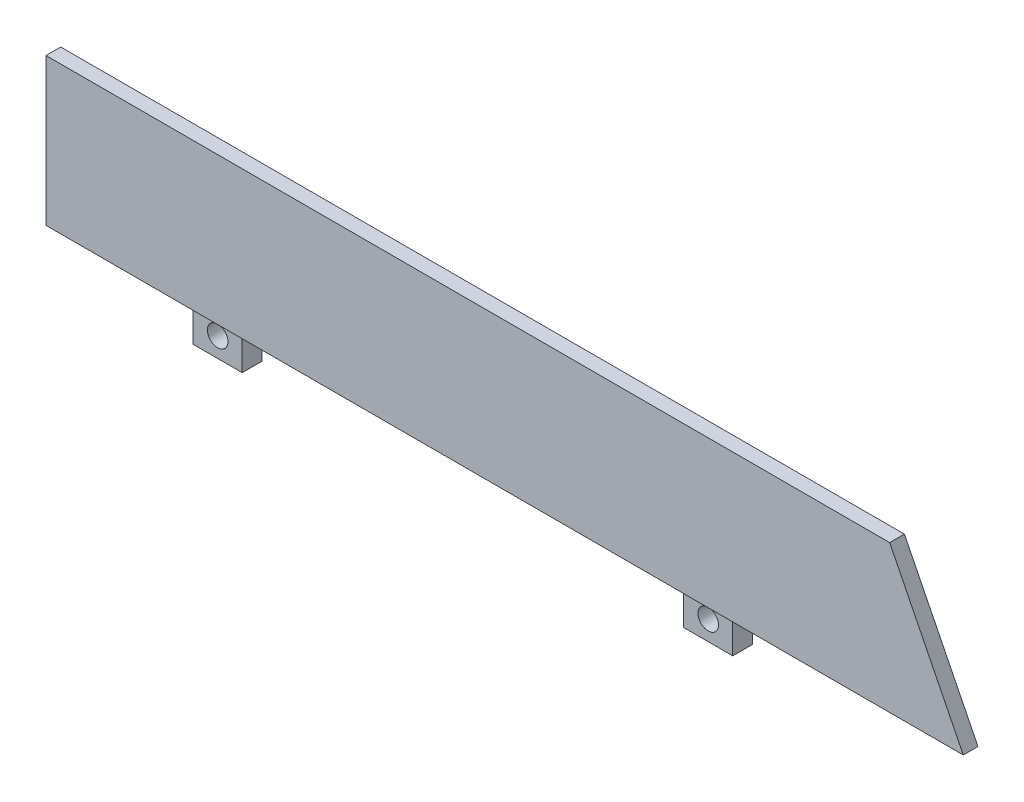
ISO-10303-21;
HEADER;
FILE_DESCRIPTION(('STEP AP214'),'2;1');
FILE_NAME('part.step','',(''),(''),'','','');
FILE_SCHEMA(('AUTOMOTIVE_DESIGN { 1 0 10303 214 1 1 1 1 }'));
ENDSEC;
DATA;
#1=APPLICATION_CONTEXT('core data for automotive mechanical design processes');
#2=APPLICATION_PROTOCOL_DEFINITION('international standard','automotive_design',2000,#1);
#3=PRODUCT_CONTEXT('',#1,'mechanical');
#4=PRODUCT('Part','Part','',(#3));
#5=PRODUCT_RELATED_PRODUCT_CATEGORY('part','',(#4));
#6=PRODUCT_DEFINITION_FORMATION('','',#4);
#7=PRODUCT_DEFINITION_CONTEXT('part definition',#1,'design');
#8=PRODUCT_DEFINITION('design','',#6,#7);
#9=PRODUCT_DEFINITION_SHAPE('','',#8);
#10=(LENGTH_UNIT() NAMED_UNIT(*) SI_UNIT(.MILLI.,.METRE.));
#11=(NAMED_UNIT(*) PLANE_ANGLE_UNIT() SI_UNIT($,.RADIAN.));
#12=(NAMED_UNIT(*) SI_UNIT($,.STERADIAN.) SOLID_ANGLE_UNIT());
#13=UNCERTAINTY_MEASURE_WITH_UNIT(LENGTH_MEASURE(1.E-05),#10,'distance_accuracy_value','');
#14=(GEOMETRIC_REPRESENTATION_CONTEXT(3) GLOBAL_UNCERTAINTY_ASSIGNED_CONTEXT((#13)) GLOBAL_UNIT_ASSIGNED_CONTEXT((#10,
#11,#12)) REPRESENTATION_CONTEXT('',''));
#15=CARTESIAN_POINT('',(0.,0.,0.));
#16=DIRECTION('',(0.,0.,1.));
#17=DIRECTION('',(1.,0.,0.));
#18=AXIS2_PLACEMENT_3D('',#15,#16,#17);
#19=CARTESIAN_POINT('',(0.,0.,0.));
#20=DIRECTION('',(0.,0.,-1.));
#21=DIRECTION('',(-1.,0.,0.));
#22=AXIS2_PLACEMENT_3D('',#19,#20,#21);
#23=PLANE('',#22);
#24=DIRECTION('',(1.,0.,0.));
#25=VECTOR('',#24,1.);
#26=CARTESIAN_POINT('',(0.,0.,0.));
#27=LINE('',#26,#25);
#28=CARTESIAN_POINT('',(41.0000000000001,0.,0.));
#29=VERTEX_POINT('',#28);
#30=CARTESIAN_POINT('',(123.,0.,0.));
#31=VERTEX_POINT('',#30);
#32=EDGE_CURVE('E387',#29,#31,#27,.T.);
#33=ORIENTED_EDGE('',*,*,#32,.F.);
#34=DIRECTION('',(0.,1.,0.));
#35=VECTOR('',#34,1.);
#36=CARTESIAN_POINT('',(41.0000000000001,0.,0.));
#37=LINE('',#36,#35);
#38=CARTESIAN_POINT('',(41.0000000000001,9.00000000000006,0.));
#39=VERTEX_POINT('',#38);
#40=EDGE_CURVE('E333',#29,#39,#37,.T.);
#41=ORIENTED_EDGE('',*,*,#40,.T.);
#42=DIRECTION('',(-1.,0.,0.));
#43=VECTOR('',#42,1.);
#44=CARTESIAN_POINT('',(0.,9.00000000000006,0.));
#45=LINE('',#44,#43);
#46=CARTESIAN_POINT('',(22.9999999999999,9.00000000000006,0.));
#47=VERTEX_POINT('',#46);
#48=EDGE_CURVE('E330',#39,#47,#45,.T.);
#49=ORIENTED_EDGE('',*,*,#48,.T.);
#50=DIRECTION('',(0.,-1.,0.));
#51=VECTOR('',#50,1.);
#52=CARTESIAN_POINT('',(22.9999999999999,0.,0.));
#53=LINE('',#52,#51);
#54=CARTESIAN_POINT('',(22.9999999999999,0.,0.));
#55=VERTEX_POINT('',#54);
#56=EDGE_CURVE('E327',#47,#55,#53,.T.);
#57=ORIENTED_EDGE('',*,*,#56,.T.);
#58=CARTESIAN_POINT('',(0.,0.,0.));
#59=VERTEX_POINT('',#58);
#60=EDGE_CURVE('E290',#59,#55,#27,.T.);
#61=ORIENTED_EDGE('',*,*,#60,.F.);
#62=DIRECTION('',(0.,-1.,0.));
#63=VECTOR('',#62,1.);
#64=CARTESIAN_POINT('',(0.,0.,0.));
#65=LINE('',#64,#63);
#66=CARTESIAN_POINT('',(0.,30.,0.));
#67=VERTEX_POINT('',#66);
#68=EDGE_CURVE('E270',#67,#59,#65,.T.);
#69=ORIENTED_EDGE('',*,*,#68,.F.);
#70=DIRECTION('',(-1.,0.,0.));
#71=VECTOR('',#70,1.);
#72=CARTESIAN_POINT('',(0.,30.,0.));
#73=LINE('',#72,#71);
#74=CARTESIAN_POINT('',(171.996760863076,30.,0.));
#75=VERTEX_POINT('',#74);
#76=EDGE_CURVE('E276',#75,#67,#73,.T.);
#77=ORIENTED_EDGE('',*,*,#76,.F.);
#78=DIRECTION('',(-0.447290848418708,0.894388560370084,0.));
#79=VECTOR('',#78,1.);
#80=CARTESIAN_POINT('',(171.996760863076,30.,0.));
#81=LINE('',#80,#79);
#82=CARTESIAN_POINT('',(187.,0.,0.));
#83=VERTEX_POINT('',#82);
#84=EDGE_CURVE('E294',#83,#75,#81,.T.);
#85=ORIENTED_EDGE('',*,*,#84,.F.);
#86=CARTESIAN_POINT('',(141.,0.,0.));
#87=VERTEX_POINT('',#86);
#88=EDGE_CURVE('E289',#87,#83,#27,.T.);
#89=ORIENTED_EDGE('',*,*,#88,.F.);
#90=DIRECTION('',(0.,1.,0.));
#91=VECTOR('',#90,1.);
#92=CARTESIAN_POINT('',(141.,0.,0.));
#93=LINE('',#92,#91);
#94=CARTESIAN_POINT('',(141.,9.00000000000001,0.));
#95=VERTEX_POINT('',#94);
#96=EDGE_CURVE('E318',#87,#95,#93,.T.);
#97=ORIENTED_EDGE('',*,*,#96,.T.);
#98=DIRECTION('',(-1.,0.,0.));
#99=VECTOR('',#98,1.);
#100=CARTESIAN_POINT('',(0.,8.99999999999999,0.));
#101=LINE('',#100,#99);
#102=CARTESIAN_POINT('',(123.,9.00000000000001,0.));
#103=VERTEX_POINT('',#102);
#104=EDGE_CURVE('E321',#95,#103,#101,.T.);
#105=ORIENTED_EDGE('',*,*,#104,.T.);
#106=DIRECTION('',(0.,-1.,0.));
#107=VECTOR('',#106,1.);
#108=CARTESIAN_POINT('',(123.,0.,0.));
#109=LINE('',#108,#107);
#110=EDGE_CURVE('E324',#103,#31,#109,.T.);
#111=ORIENTED_EDGE('',*,*,#110,.T.);
#112=EDGE_LOOP('',(#33,#41,#49,#57,#61,#69,#77,#85,#89,#97,#105,#111));
#113=FACE_BOUND('',#112,.T.);
#114=ADVANCED_FACE('F47',(#113),#23,.T.);
#115=CARTESIAN_POINT('',(0.,0.,3.));
#116=DIRECTION('',(1.,0.,0.));
#117=DIRECTION('',(0.,0.,-1.));
#118=AXIS2_PLACEMENT_3D('',#115,#116,#117);
#119=PLANE('',#118);
#120=ORIENTED_EDGE('',*,*,#68,.T.);
#121=DIRECTION('',(0.,0.,-1.));
#122=VECTOR('',#121,1.);
#123=CARTESIAN_POINT('',(0.,0.,3.));
#124=LINE('',#123,#122);
#125=CARTESIAN_POINT('',(0.,0.,3.));
#126=VERTEX_POINT('',#125);
#127=EDGE_CURVE('E311',#126,#59,#124,.T.);
#128=ORIENTED_EDGE('',*,*,#127,.F.);
#129=DIRECTION('',(0.,-1.,0.));
#130=VECTOR('',#129,1.);
#131=CARTESIAN_POINT('',(0.,0.,3.));
#132=LINE('',#131,#130);
#133=CARTESIAN_POINT('',(0.,30.,3.));
#134=VERTEX_POINT('',#133);
#135=EDGE_CURVE('E271',#134,#126,#132,.T.);
#136=ORIENTED_EDGE('',*,*,#135,.F.);
#137=DIRECTION('',(0.,0.,-1.));
#138=VECTOR('',#137,1.);
#139=CARTESIAN_POINT('',(0.,30.,3.));
#140=LINE('',#139,#138);
#141=EDGE_CURVE('E285',#134,#67,#140,.T.);
#142=ORIENTED_EDGE('',*,*,#141,.T.);
#143=EDGE_LOOP('',(#120,#128,#136,#142));
#144=FACE_BOUND('',#143,.T.);
#145=ADVANCED_FACE('F422',(#144),#119,.F.);
#146=CARTESIAN_POINT('',(0.,0.,3.));
#147=DIRECTION('',(0.,1.,0.));
#148=DIRECTION('',(0.,0.,1.));
#149=AXIS2_PLACEMENT_3D('',#146,#147,#148);
#150=PLANE('',#149);
#151=ORIENTED_EDGE('',*,*,#60,.T.);
#152=DIRECTION('',(0.707106781186552,0.,-0.707106781186543));
#153=VECTOR('',#152,1.);
#154=CARTESIAN_POINT('',(9.99999999999981,0.,12.9999999999999));
#155=LINE('',#154,#153);
#156=CARTESIAN_POINT('',(27.,0.,-4.));
#157=VERTEX_POINT('',#156);
#158=EDGE_CURVE('E346',#55,#157,#155,.T.);
#159=ORIENTED_EDGE('',*,*,#158,.T.);
#160=DIRECTION('',(0.,0.,-1.));
#161=VECTOR('',#160,1.);
#162=CARTESIAN_POINT('',(27.,0.,3.));
#163=LINE('',#162,#161);
#164=CARTESIAN_POINT('',(27.,0.,0.));
#165=VERTEX_POINT('',#164);
#166=EDGE_CURVE('E73',#165,#157,#163,.T.);
#167=ORIENTED_EDGE('',*,*,#166,.F.);
#168=CARTESIAN_POINT('',(37.,0.,0.));
#169=VERTEX_POINT('',#168);
#170=EDGE_CURVE('E201',#165,#169,#27,.T.);
#171=ORIENTED_EDGE('',*,*,#170,.T.);
#172=DIRECTION('',(0.,0.,1.));
#173=VECTOR('',#172,1.);
#174=CARTESIAN_POINT('',(37.,0.,3.));
#175=LINE('',#174,#173);
#176=CARTESIAN_POINT('',(37.,0.,-4.));
#177=VERTEX_POINT('',#176);
#178=EDGE_CURVE('E315',#177,#169,#175,.T.);
#179=ORIENTED_EDGE('',*,*,#178,.F.);
#180=DIRECTION('',(0.707106781186552,0.,0.707106781186543));
#181=VECTOR('',#180,1.);
#182=CARTESIAN_POINT('',(21.9999999999997,0.,-19.0000000000001));
#183=LINE('',#182,#181);
#184=EDGE_CURVE('E343',#177,#29,#183,.T.);
#185=ORIENTED_EDGE('',*,*,#184,.T.);
#186=ORIENTED_EDGE('',*,*,#32,.T.);
#187=DIRECTION('',(0.707106781186543,0.,-0.707106781186552));
#188=VECTOR('',#187,1.);
#189=CARTESIAN_POINT('',(60.0000000000009,0.,63.));
#190=LINE('',#189,#188);
#191=CARTESIAN_POINT('',(127.,0.,-4.));
#192=VERTEX_POINT('',#191);
#193=EDGE_CURVE('E58',#31,#192,#190,.T.);
#194=ORIENTED_EDGE('',*,*,#193,.T.);
#195=DIRECTION('',(0.,0.,-1.));
#196=VECTOR('',#195,1.);
#197=CARTESIAN_POINT('',(127.,0.,3.));
#198=LINE('',#197,#196);
#199=CARTESIAN_POINT('',(127.,0.,0.));
#200=VERTEX_POINT('',#199);
#201=EDGE_CURVE('E66',#200,#192,#198,.T.);
#202=ORIENTED_EDGE('',*,*,#201,.F.);
#203=CARTESIAN_POINT('',(137.,0.,0.));
#204=VERTEX_POINT('',#203);
#205=EDGE_CURVE('E295',#200,#204,#27,.T.);
#206=ORIENTED_EDGE('',*,*,#205,.T.);
#207=DIRECTION('',(0.,0.,1.));
#208=VECTOR('',#207,1.);
#209=CARTESIAN_POINT('',(137.,0.,3.));
#210=LINE('',#209,#208);
#211=CARTESIAN_POINT('',(137.,0.,-4.));
#212=VERTEX_POINT('',#211);
#213=EDGE_CURVE('E340',#212,#204,#210,.T.);
#214=ORIENTED_EDGE('',*,*,#213,.F.);
#215=DIRECTION('',(0.707106781186543,0.,0.707106781186552));
#216=VECTOR('',#215,1.);
#217=CARTESIAN_POINT('',(72.000000000001,0.,-69.));
#218=LINE('',#217,#216);
#219=EDGE_CURVE('E11',#212,#87,#218,.T.);
#220=ORIENTED_EDGE('',*,*,#219,.T.);
#221=ORIENTED_EDGE('',*,*,#88,.T.);
#222=DIRECTION('',(0.,0.,-1.));
#223=VECTOR('',#222,1.);
#224=CARTESIAN_POINT('',(187.,0.,3.));
#225=LINE('',#224,#223);
#226=CARTESIAN_POINT('',(187.,0.,3.));
#227=VERTEX_POINT('',#226);
#228=EDGE_CURVE('E307',#227,#83,#225,.T.);
#229=ORIENTED_EDGE('',*,*,#228,.F.);
#230=DIRECTION('',(1.,0.,0.));
#231=VECTOR('',#230,1.);
#232=CARTESIAN_POINT('',(0.,0.,3.));
#233=LINE('',#232,#231);
#234=EDGE_CURVE('E275',#126,#227,#233,.T.);
#235=ORIENTED_EDGE('',*,*,#234,.F.);
#236=ORIENTED_EDGE('',*,*,#127,.T.);
#237=EDGE_LOOP('',(#151,#159,#167,#171,#179,#185,#186,#194,#202,#206,#214,#220,#221,#229,#235,#236));
#238=FACE_BOUND('',#237,.T.);
#239=ADVANCED_FACE('F392',(#238),#150,.F.);
#240=CARTESIAN_POINT('',(171.996760863076,30.,3.));
#241=DIRECTION('',(-0.894388560370085,-0.447290848418708,0.));
#242=DIRECTION('',(0.447290848418708,-0.894388560370085,0.));
#243=AXIS2_PLACEMENT_3D('',#240,#241,#242);
#244=PLANE('',#243);
#245=ORIENTED_EDGE('',*,*,#84,.T.);
#246=DIRECTION('',(0.,0.,-1.));
#247=VECTOR('',#246,1.);
#248=CARTESIAN_POINT('',(171.996760863076,30.,3.));
#249=LINE('',#248,#247);
#250=CARTESIAN_POINT('',(171.996760863076,30.,3.));
#251=VERTEX_POINT('',#250);
#252=EDGE_CURVE('E303',#251,#75,#249,.T.);
#253=ORIENTED_EDGE('',*,*,#252,.F.);
#254=DIRECTION('',(-0.447290848418708,0.894388560370084,0.));
#255=VECTOR('',#254,1.);
#256=CARTESIAN_POINT('',(171.996760863076,30.,3.));
#257=LINE('',#256,#255);
#258=EDGE_CURVE('E279',#227,#251,#257,.T.);
#259=ORIENTED_EDGE('',*,*,#258,.F.);
#260=ORIENTED_EDGE('',*,*,#228,.T.);
#261=EDGE_LOOP('',(#245,#253,#259,#260));
#262=FACE_BOUND('',#261,.T.);
#263=ADVANCED_FACE('F433',(#262),#244,.F.);
#264=CARTESIAN_POINT('',(0.,30.,3.));
#265=DIRECTION('',(0.,-1.,0.));
#266=DIRECTION('',(0.,0.,-1.));
#267=AXIS2_PLACEMENT_3D('',#264,#265,#266);
#268=PLANE('',#267);
#269=ORIENTED_EDGE('',*,*,#76,.T.);
#270=ORIENTED_EDGE('',*,*,#141,.F.);
#271=DIRECTION('',(-1.,0.,0.));
#272=VECTOR('',#271,1.);
#273=CARTESIAN_POINT('',(0.,30.,3.));
#274=LINE('',#273,#272);
#275=EDGE_CURVE('E282',#251,#134,#274,.T.);
#276=ORIENTED_EDGE('',*,*,#275,.F.);
#277=ORIENTED_EDGE('',*,*,#252,.T.);
#278=EDGE_LOOP('',(#269,#270,#276,#277));
#279=FACE_BOUND('',#278,.T.);
#280=ADVANCED_FACE('F428',(#279),#268,.F.);
#281=CARTESIAN_POINT('',(0.,0.,3.));
#282=DIRECTION('',(0.,0.,-1.));
#283=DIRECTION('',(-1.,0.,0.));
#284=AXIS2_PLACEMENT_3D('',#281,#282,#283);
#285=PLANE('',#284);
#286=ORIENTED_EDGE('',*,*,#135,.T.);
#287=ORIENTED_EDGE('',*,*,#234,.T.);
#288=ORIENTED_EDGE('',*,*,#258,.T.);
#289=ORIENTED_EDGE('',*,*,#275,.T.);
#290=EDGE_LOOP('',(#286,#287,#288,#289));
#291=FACE_BOUND('',#290,.T.);
#292=ADVANCED_FACE('F471',(#291),#285,.F.);
#293=CARTESIAN_POINT('',(0.,0.,-4.));
#294=DIRECTION('',(0.,0.,-1.));
#295=DIRECTION('',(-1.,0.,0.));
#296=AXIS2_PLACEMENT_3D('',#293,#294,#295);
#297=PLANE('',#296);
#298=DIRECTION('',(0.,-1.,0.));
#299=VECTOR('',#298,1.);
#300=CARTESIAN_POINT('',(137.,5.,-4.));
#301=LINE('',#300,#299);
#302=CARTESIAN_POINT('',(137.,5.,-4.));
#303=VERTEX_POINT('',#302);
#304=EDGE_CURVE('E238',#303,#212,#301,.T.);
#305=ORIENTED_EDGE('',*,*,#304,.T.);
#306=CARTESIAN_POINT('',(137.,-9.,-4.));
#307=VERTEX_POINT('',#306);
#308=EDGE_CURVE('E243',#212,#307,#301,.T.);
#309=ORIENTED_EDGE('',*,*,#308,.T.);
#310=DIRECTION('',(-1.,0.,0.));
#311=VECTOR('',#310,1.);
#312=CARTESIAN_POINT('',(137.,-9.,-4.));
#313=LINE('',#312,#311);
#314=CARTESIAN_POINT('',(127.,-9.,-4.));
#315=VERTEX_POINT('',#314);
#316=EDGE_CURVE('E242',#307,#315,#313,.T.);
#317=ORIENTED_EDGE('',*,*,#316,.T.);
#318=DIRECTION('',(0.,1.,0.));
#319=VECTOR('',#318,1.);
#320=CARTESIAN_POINT('',(127.,5.,-4.));
#321=LINE('',#320,#319);
#322=EDGE_CURVE('E247',#315,#192,#321,.T.);
#323=ORIENTED_EDGE('',*,*,#322,.T.);
#324=CARTESIAN_POINT('',(127.,5.,-4.));
#325=VERTEX_POINT('',#324);
#326=EDGE_CURVE('E246',#192,#325,#321,.T.);
#327=ORIENTED_EDGE('',*,*,#326,.T.);
#328=DIRECTION('',(1.,0.,0.));
#329=VECTOR('',#328,1.);
#330=CARTESIAN_POINT('',(137.,5.,-4.));
#331=LINE('',#330,#329);
#332=EDGE_CURVE('E251',#325,#303,#331,.T.);
#333=ORIENTED_EDGE('',*,*,#332,.T.);
#334=EDGE_LOOP('',(#305,#309,#317,#323,#327,#333));
#335=FACE_BOUND('',#334,.T.);
#336=CARTESIAN_POINT('',(132.,-5.,-4.));
#337=DIRECTION('',(0.,0.,-1.));
#338=DIRECTION('',(-1.,0.,0.));
#339=AXIS2_PLACEMENT_3D('',#336,#337,#338);
#340=CIRCLE('',#339,2.09999999999999);
#341=CARTESIAN_POINT('',(129.9,-5.,-4.));
#342=VERTEX_POINT('',#341);
#343=EDGE_CURVE('E230',#342,#342,#340,.T.);
#344=ORIENTED_EDGE('',*,*,#343,.F.);
#345=EDGE_LOOP('',(#344));
#346=FACE_BOUND('',#345,.T.);
#347=ADVANCED_FACE('F377',(#335,#346),#297,.T.);
#348=CARTESIAN_POINT('',(0.,0.,0.));
#349=DIRECTION('',(0.,0.,-1.));
#350=DIRECTION('',(-1.,0.,0.));
#351=AXIS2_PLACEMENT_3D('',#348,#349,#350);
#352=PLANE('',#351);
#353=ORIENTED_EDGE('',*,*,#205,.F.);
#354=DIRECTION('',(0.,1.,0.));
#355=VECTOR('',#354,1.);
#356=CARTESIAN_POINT('',(127.,5.,0.));
#357=LINE('',#356,#355);
#358=CARTESIAN_POINT('',(127.,-9.,0.));
#359=VERTEX_POINT('',#358);
#360=EDGE_CURVE('E260',#359,#200,#357,.T.);
#361=ORIENTED_EDGE('',*,*,#360,.F.);
#362=DIRECTION('',(-1.,0.,0.));
#363=VECTOR('',#362,1.);
#364=CARTESIAN_POINT('',(137.,-9.,0.));
#365=LINE('',#364,#363);
#366=CARTESIAN_POINT('',(137.,-9.,0.));
#367=VERTEX_POINT('',#366);
#368=EDGE_CURVE('E257',#367,#359,#365,.T.);
#369=ORIENTED_EDGE('',*,*,#368,.F.);
#370=DIRECTION('',(0.,-1.,0.));
#371=VECTOR('',#370,1.);
#372=CARTESIAN_POINT('',(137.,5.,0.));
#373=LINE('',#372,#371);
#374=EDGE_CURVE('E234',#204,#367,#373,.T.);
#375=ORIENTED_EDGE('',*,*,#374,.F.);
#376=EDGE_LOOP('',(#353,#361,#369,#375));
#377=FACE_BOUND('',#376,.T.);
#378=CARTESIAN_POINT('',(132.,-5.,0.));
#379=DIRECTION('',(0.,0.,-1.));
#380=DIRECTION('',(-1.,0.,0.));
#381=AXIS2_PLACEMENT_3D('',#378,#379,#380);
#382=CIRCLE('',#381,2.09999999999999);
#383=CARTESIAN_POINT('',(129.9,-5.,0.));
#384=VERTEX_POINT('',#383);
#385=EDGE_CURVE('E226',#384,#384,#382,.T.);
#386=ORIENTED_EDGE('',*,*,#385,.T.);
#387=EDGE_LOOP('',(#386));
#388=FACE_BOUND('',#387,.T.);
#389=ADVANCED_FACE('F443',(#377,#388),#352,.F.);
#390=CARTESIAN_POINT('',(137.,5.,-4.));
#391=DIRECTION('',(-1.,0.,0.));
#392=DIRECTION('',(0.,0.,1.));
#393=AXIS2_PLACEMENT_3D('',#390,#391,#392);
#394=PLANE('',#393);
#395=ORIENTED_EDGE('',*,*,#308,.F.);
#396=ORIENTED_EDGE('',*,*,#213,.T.);
#397=ORIENTED_EDGE('',*,*,#374,.T.);
#398=DIRECTION('',(0.,0.,1.));
#399=VECTOR('',#398,1.);
#400=CARTESIAN_POINT('',(137.,-9.,-4.));
#401=LINE('',#400,#399);
#402=EDGE_CURVE('E266',#307,#367,#401,.T.);
#403=ORIENTED_EDGE('',*,*,#402,.F.);
#404=EDGE_LOOP('',(#395,#396,#397,#403));
#405=FACE_BOUND('',#404,.T.);
#406=ADVANCED_FACE('F447',(#405),#394,.F.);
#407=CARTESIAN_POINT('',(137.,-9.,-4.));
#408=DIRECTION('',(0.,1.,0.));
#409=DIRECTION('',(0.,0.,1.));
#410=AXIS2_PLACEMENT_3D('',#407,#408,#409);
#411=PLANE('',#410);
#412=ORIENTED_EDGE('',*,*,#368,.T.);
#413=DIRECTION('',(0.,0.,1.));
#414=VECTOR('',#413,1.);
#415=CARTESIAN_POINT('',(127.,-9.,-4.));
#416=LINE('',#415,#414);
#417=EDGE_CURVE('E254',#315,#359,#416,.T.);
#418=ORIENTED_EDGE('',*,*,#417,.F.);
#419=ORIENTED_EDGE('',*,*,#316,.F.);
#420=ORIENTED_EDGE('',*,*,#402,.T.);
#421=EDGE_LOOP('',(#412,#418,#419,#420));
#422=FACE_BOUND('',#421,.T.);
#423=ADVANCED_FACE('F449',(#422),#411,.F.);
#424=CARTESIAN_POINT('',(127.,5.,-4.));
#425=DIRECTION('',(1.,0.,0.));
#426=DIRECTION('',(0.,0.,-1.));
#427=AXIS2_PLACEMENT_3D('',#424,#425,#426);
#428=PLANE('',#427);
#429=ORIENTED_EDGE('',*,*,#360,.T.);
#430=ORIENTED_EDGE('',*,*,#201,.T.);
#431=ORIENTED_EDGE('',*,*,#322,.F.);
#432=ORIENTED_EDGE('',*,*,#417,.T.);
#433=EDGE_LOOP('',(#429,#430,#431,#432));
#434=FACE_BOUND('',#433,.T.);
#435=ADVANCED_FACE('F436',(#434),#428,.F.);
#436=CARTESIAN_POINT('',(132.,-5.,-4.));
#437=DIRECTION('',(0.,0.,1.));
#438=DIRECTION('',(1.,0.,0.));
#439=AXIS2_PLACEMENT_3D('',#436,#437,#438);
#440=CYLINDRICAL_SURFACE('',#439,2.09999999999999);
#441=ORIENTED_EDGE('',*,*,#343,.T.);
#442=EDGE_LOOP('',(#441));
#443=FACE_BOUND('',#442,.T.);
#444=ORIENTED_EDGE('',*,*,#385,.F.);
#445=EDGE_LOOP('',(#444));
#446=FACE_BOUND('',#445,.T.);
#447=ADVANCED_FACE('F457',(#443,#446),#440,.F.);
#448=CARTESIAN_POINT('',(0.,0.,0.));
#449=DIRECTION('',(0.,0.,1.));
#450=DIRECTION('',(1.,0.,0.));
#451=AXIS2_PLACEMENT_3D('',#448,#449,#450);
#452=PLANE('',#451);
#453=CARTESIAN_POINT('',(32.,-5.,0.));
#454=DIRECTION('',(0.,0.,-1.));
#455=DIRECTION('',(-1.,0.,0.));
#456=AXIS2_PLACEMENT_3D('',#453,#454,#455);
#457=CIRCLE('',#456,2.09999999999999);
#458=CARTESIAN_POINT('',(29.9,-5.,0.));
#459=VERTEX_POINT('',#458);
#460=EDGE_CURVE('E222',#459,#459,#457,.T.);
#461=ORIENTED_EDGE('',*,*,#460,.T.);
#462=EDGE_LOOP('',(#461));
#463=FACE_BOUND('',#462,.T.);
#464=ORIENTED_EDGE('',*,*,#170,.F.);
#465=DIRECTION('',(0.,1.,0.));
#466=VECTOR('',#465,1.);
#467=CARTESIAN_POINT('',(27.,5.,0.));
#468=LINE('',#467,#466);
#469=CARTESIAN_POINT('',(27.,-9.,0.));
#470=VERTEX_POINT('',#469);
#471=EDGE_CURVE('E190',#470,#165,#468,.T.);
#472=ORIENTED_EDGE('',*,*,#471,.F.);
#473=DIRECTION('',(-1.,0.,0.));
#474=VECTOR('',#473,1.);
#475=CARTESIAN_POINT('',(37.,-9.,0.));
#476=LINE('',#475,#474);
#477=CARTESIAN_POINT('',(37.,-9.,0.));
#478=VERTEX_POINT('',#477);
#479=EDGE_CURVE('E177',#478,#470,#476,.T.);
#480=ORIENTED_EDGE('',*,*,#479,.F.);
#481=DIRECTION('',(0.,-1.,0.));
#482=VECTOR('',#481,1.);
#483=CARTESIAN_POINT('',(37.,5.,0.));
#484=LINE('',#483,#482);
#485=EDGE_CURVE('E189',#169,#478,#484,.T.);
#486=ORIENTED_EDGE('',*,*,#485,.F.);
#487=EDGE_LOOP('',(#464,#472,#480,#486));
#488=FACE_BOUND('',#487,.T.);
#489=ADVANCED_FACE('F200',(#463,#488),#452,.T.);
#490=CARTESIAN_POINT('',(0.,0.,-4.));
#491=DIRECTION('',(0.,0.,1.));
#492=DIRECTION('',(1.,0.,0.));
#493=AXIS2_PLACEMENT_3D('',#490,#491,#492);
#494=PLANE('',#493);
#495=DIRECTION('',(1.,0.,0.));
#496=VECTOR('',#495,1.);
#497=CARTESIAN_POINT('',(37.,5.,-4.));
#498=LINE('',#497,#496);
#499=CARTESIAN_POINT('',(27.,5.,-4.));
#500=VERTEX_POINT('',#499);
#501=CARTESIAN_POINT('',(37.,5.,-4.));
#502=VERTEX_POINT('',#501);
#503=EDGE_CURVE('E203',#500,#502,#498,.T.);
#504=ORIENTED_EDGE('',*,*,#503,.T.);
#505=DIRECTION('',(0.,-1.,0.));
#506=VECTOR('',#505,1.);
#507=CARTESIAN_POINT('',(37.,5.,-4.));
#508=LINE('',#507,#506);
#509=EDGE_CURVE('E206',#502,#177,#508,.T.);
#510=ORIENTED_EDGE('',*,*,#509,.T.);
#511=CARTESIAN_POINT('',(37.,-9.,-4.));
#512=VERTEX_POINT('',#511);
#513=EDGE_CURVE('E218',#177,#512,#508,.T.);
#514=ORIENTED_EDGE('',*,*,#513,.T.);
#515=DIRECTION('',(-1.,0.,0.));
#516=VECTOR('',#515,1.);
#517=CARTESIAN_POINT('',(37.,-9.,-4.));
#518=LINE('',#517,#516);
#519=CARTESIAN_POINT('',(27.,-9.,-4.));
#520=VERTEX_POINT('',#519);
#521=EDGE_CURVE('E215',#512,#520,#518,.T.);
#522=ORIENTED_EDGE('',*,*,#521,.T.);
#523=DIRECTION('',(0.,1.,0.));
#524=VECTOR('',#523,1.);
#525=CARTESIAN_POINT('',(27.,5.,-4.));
#526=LINE('',#525,#524);
#527=EDGE_CURVE('E196',#520,#157,#526,.T.);
#528=ORIENTED_EDGE('',*,*,#527,.T.);
#529=EDGE_CURVE('E198',#157,#500,#526,.T.);
#530=ORIENTED_EDGE('',*,*,#529,.T.);
#531=EDGE_LOOP('',(#504,#510,#514,#522,#528,#530));
#532=FACE_BOUND('',#531,.T.);
#533=CARTESIAN_POINT('',(32.,-5.,-4.));
#534=DIRECTION('',(0.,0.,-1.));
#535=DIRECTION('',(-1.,0.,0.));
#536=AXIS2_PLACEMENT_3D('',#533,#534,#535);
#537=CIRCLE('',#536,2.09999999999999);
#538=CARTESIAN_POINT('',(29.9,-5.,-4.));
#539=VERTEX_POINT('',#538);
#540=EDGE_CURVE('E212',#539,#539,#537,.T.);
#541=ORIENTED_EDGE('',*,*,#540,.F.);
#542=EDGE_LOOP('',(#541));
#543=FACE_BOUND('',#542,.T.);
#544=ADVANCED_FACE('F400',(#532,#543),#494,.F.);
#545=CARTESIAN_POINT('',(37.,5.,-4.));
#546=DIRECTION('',(-1.,0.,0.));
#547=DIRECTION('',(0.,0.,1.));
#548=AXIS2_PLACEMENT_3D('',#545,#546,#547);
#549=PLANE('',#548);
#550=ORIENTED_EDGE('',*,*,#513,.F.);
#551=ORIENTED_EDGE('',*,*,#178,.T.);
#552=ORIENTED_EDGE('',*,*,#485,.T.);
#553=DIRECTION('',(0.,0.,1.));
#554=VECTOR('',#553,1.);
#555=CARTESIAN_POINT('',(37.,-9.,-4.));
#556=LINE('',#555,#554);
#557=EDGE_CURVE('E184',#512,#478,#556,.T.);
#558=ORIENTED_EDGE('',*,*,#557,.F.);
#559=EDGE_LOOP('',(#550,#551,#552,#558));
#560=FACE_BOUND('',#559,.T.);
#561=ADVANCED_FACE('F396',(#560),#549,.F.);
#562=CARTESIAN_POINT('',(37.,-9.,-4.));
#563=DIRECTION('',(0.,1.,0.));
#564=DIRECTION('',(0.,0.,1.));
#565=AXIS2_PLACEMENT_3D('',#562,#563,#564);
#566=PLANE('',#565);
#567=ORIENTED_EDGE('',*,*,#479,.T.);
#568=DIRECTION('',(0.,0.,1.));
#569=VECTOR('',#568,1.);
#570=CARTESIAN_POINT('',(27.,-9.,-4.));
#571=LINE('',#570,#569);
#572=EDGE_CURVE('E181',#520,#470,#571,.T.);
#573=ORIENTED_EDGE('',*,*,#572,.F.);
#574=ORIENTED_EDGE('',*,*,#521,.F.);
#575=ORIENTED_EDGE('',*,*,#557,.T.);
#576=EDGE_LOOP('',(#567,#573,#574,#575));
#577=FACE_BOUND('',#576,.T.);
#578=ADVANCED_FACE('F179',(#577),#566,.F.);
#579=CARTESIAN_POINT('',(27.,5.,-4.));
#580=DIRECTION('',(1.,0.,0.));
#581=DIRECTION('',(0.,0.,-1.));
#582=AXIS2_PLACEMENT_3D('',#579,#580,#581);
#583=PLANE('',#582);
#584=ORIENTED_EDGE('',*,*,#471,.T.);
#585=ORIENTED_EDGE('',*,*,#166,.T.);
#586=ORIENTED_EDGE('',*,*,#527,.F.);
#587=ORIENTED_EDGE('',*,*,#572,.T.);
#588=EDGE_LOOP('',(#584,#585,#586,#587));
#589=FACE_BOUND('',#588,.T.);
#590=ADVANCED_FACE('F193',(#589),#583,.F.);
#591=CARTESIAN_POINT('',(32.,-5.,-4.));
#592=DIRECTION('',(0.,0.,1.));
#593=DIRECTION('',(1.,0.,0.));
#594=AXIS2_PLACEMENT_3D('',#591,#592,#593);
#595=CYLINDRICAL_SURFACE('',#594,2.09999999999999);
#596=ORIENTED_EDGE('',*,*,#540,.T.);
#597=EDGE_LOOP('',(#596));
#598=FACE_BOUND('',#597,.T.);
#599=ORIENTED_EDGE('',*,*,#460,.F.);
#600=EDGE_LOOP('',(#599));
#601=FACE_BOUND('',#600,.T.);
#602=ADVANCED_FACE('F492',(#598,#601),#595,.F.);
#603=CARTESIAN_POINT('',(22.9999999999999,0.,0.));
#604=DIRECTION('',(0.707106781186542,0.,0.707106781186552));
#605=DIRECTION('',(0.,-1.,0.));
#606=AXIS2_PLACEMENT_3D('',#603,#604,#605);
#607=PLANE('',#606);
#608=ORIENTED_EDGE('',*,*,#158,.F.);
#609=ORIENTED_EDGE('',*,*,#56,.F.);
#610=DIRECTION('',(0.577350269189629,-0.577350269189629,-0.577350269189621));
#611=VECTOR('',#610,1.);
#612=CARTESIAN_POINT('',(26.,6.00000000000001,-3.00000000000001));
#613=LINE('',#612,#611);
#614=EDGE_CURVE('E355',#500,#47,#613,.F.);
#615=ORIENTED_EDGE('',*,*,#614,.F.);
#616=ORIENTED_EDGE('',*,*,#529,.F.);
#617=EDGE_LOOP('',(#608,#609,#615,#616));
#618=FACE_BOUND('',#617,.T.);
#619=ADVANCED_FACE('F416',(#618),#607,.F.);
#620=CARTESIAN_POINT('',(37.,5.,-4.));
#621=DIRECTION('',(0.,-0.707106781186542,0.707106781186552));
#622=DIRECTION('',(1.,0.,0.));
#623=AXIS2_PLACEMENT_3D('',#620,#621,#622);
#624=PLANE('',#623);
#625=ORIENTED_EDGE('',*,*,#614,.T.);
#626=ORIENTED_EDGE('',*,*,#48,.F.);
#627=DIRECTION('',(-0.577350269189628,-0.577350269189629,-0.57735026918962));
#628=VECTOR('',#627,1.);
#629=CARTESIAN_POINT('',(37.,5.,-4.));
#630=LINE('',#629,#628);
#631=EDGE_CURVE('E351',#502,#39,#630,.F.);
#632=ORIENTED_EDGE('',*,*,#631,.F.);
#633=ORIENTED_EDGE('',*,*,#503,.F.);
#634=EDGE_LOOP('',(#625,#626,#632,#633));
#635=FACE_BOUND('',#634,.T.);
#636=ADVANCED_FACE('F411',(#635),#624,.F.);
#637=CARTESIAN_POINT('',(37.,5.,-4.));
#638=DIRECTION('',(-0.707106781186542,0.,0.707106781186552));
#639=DIRECTION('',(0.,-1.,0.));
#640=AXIS2_PLACEMENT_3D('',#637,#638,#639);
#641=PLANE('',#640);
#642=ORIENTED_EDGE('',*,*,#631,.T.);
#643=ORIENTED_EDGE('',*,*,#40,.F.);
#644=ORIENTED_EDGE('',*,*,#184,.F.);
#645=ORIENTED_EDGE('',*,*,#509,.F.);
#646=EDGE_LOOP('',(#642,#643,#644,#645));
#647=FACE_BOUND('',#646,.T.);
#648=ADVANCED_FACE('F405',(#647),#641,.F.);
#649=CARTESIAN_POINT('',(137.,5.,-4.00000000000006));
#650=DIRECTION('',(-0.707106781186552,0.,0.707106781186542));
#651=DIRECTION('',(0.,-1.,0.));
#652=AXIS2_PLACEMENT_3D('',#649,#650,#651);
#653=PLANE('',#652);
#654=ORIENTED_EDGE('',*,*,#219,.F.);
#655=ORIENTED_EDGE('',*,*,#304,.F.);
#656=DIRECTION('',(0.577350269189623,0.577350269189623,0.577350269189631));
#657=VECTOR('',#656,1.);
#658=CARTESIAN_POINT('',(137.,5.,-4.00000000000006));
#659=LINE('',#658,#657);
#660=EDGE_CURVE('E52',#95,#303,#659,.F.);
#661=ORIENTED_EDGE('',*,*,#660,.F.);
#662=ORIENTED_EDGE('',*,*,#96,.F.);
#663=EDGE_LOOP('',(#654,#655,#661,#662));
#664=FACE_BOUND('',#663,.T.);
#665=ADVANCED_FACE('F50',(#664),#653,.F.);
#666=CARTESIAN_POINT('',(137.,5.,-4.00000000000006));
#667=DIRECTION('',(0.,-0.707106781186552,0.707106781186543));
#668=DIRECTION('',(1.,0.,0.));
#669=AXIS2_PLACEMENT_3D('',#666,#667,#668);
#670=PLANE('',#669);
#671=ORIENTED_EDGE('',*,*,#660,.T.);
#672=ORIENTED_EDGE('',*,*,#332,.F.);
#673=DIRECTION('',(-0.577350269189623,0.577350269189623,0.577350269189631));
#674=VECTOR('',#673,1.);
#675=CARTESIAN_POINT('',(130.333333333333,1.66666666666669,-7.33333333333341));
#676=LINE('',#675,#674);
#677=EDGE_CURVE('E358',#103,#325,#676,.F.);
#678=ORIENTED_EDGE('',*,*,#677,.F.);
#679=ORIENTED_EDGE('',*,*,#104,.F.);
#680=EDGE_LOOP('',(#671,#672,#678,#679));
#681=FACE_BOUND('',#680,.T.);
#682=ADVANCED_FACE('F370',(#681),#670,.F.);
#683=CARTESIAN_POINT('',(127.,5.,-4.00000000000006));
#684=DIRECTION('',(0.707106781186552,0.,0.707106781186542));
#685=DIRECTION('',(0.,1.,0.));
#686=AXIS2_PLACEMENT_3D('',#683,#684,#685);
#687=PLANE('',#686);
#688=ORIENTED_EDGE('',*,*,#193,.F.);
#689=ORIENTED_EDGE('',*,*,#110,.F.);
#690=ORIENTED_EDGE('',*,*,#677,.T.);
#691=ORIENTED_EDGE('',*,*,#326,.F.);
#692=EDGE_LOOP('',(#688,#689,#690,#691));
#693=FACE_BOUND('',#692,.T.);
#694=ADVANCED_FACE('F434',(#693),#687,.F.);
#695=CLOSED_SHELL('',(#114,#145,#239,#263,#280,#292,#347,#389,#406,#423,#435,#447,#489,#544,
#561,#578,#590,#602,#619,#636,#648,#665,#682,#694));
#696=MANIFOLD_SOLID_BREP('B2',#695);
#697=ADVANCED_BREP_SHAPE_REPRESENTATION('',(#18,#696),#14);
#698=SHAPE_DEFINITION_REPRESENTATION(#9,#697);
ENDSEC;
END-ISO-10303-21;
